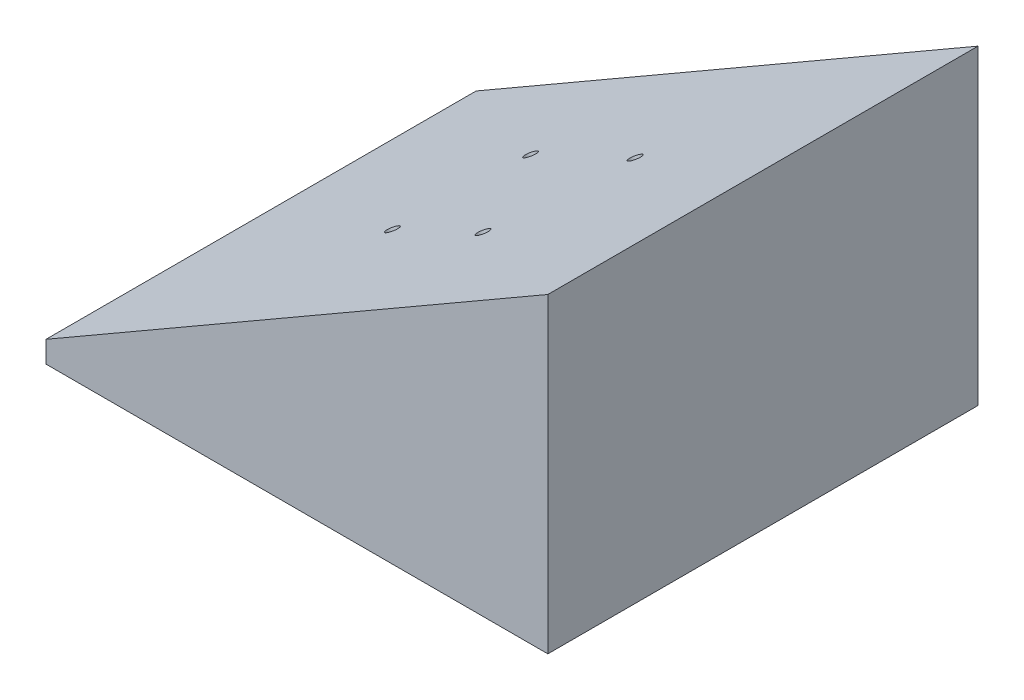
ISO-10303-21;
HEADER;
FILE_DESCRIPTION(('STEP AP214'),'2;1');
FILE_NAME('part.step','',(''),(''),'','','');
FILE_SCHEMA(('AUTOMOTIVE_DESIGN { 1 0 10303 214 1 1 1 1 }'));
ENDSEC;
DATA;
#1=APPLICATION_CONTEXT('core data for automotive mechanical design processes');
#2=APPLICATION_PROTOCOL_DEFINITION('international standard','automotive_design',2000,#1);
#3=PRODUCT_CONTEXT('',#1,'mechanical');
#4=PRODUCT('Part','Part','',(#3));
#5=PRODUCT_RELATED_PRODUCT_CATEGORY('part','',(#4));
#6=PRODUCT_DEFINITION_FORMATION('','',#4);
#7=PRODUCT_DEFINITION_CONTEXT('part definition',#1,'design');
#8=PRODUCT_DEFINITION('design','',#6,#7);
#9=PRODUCT_DEFINITION_SHAPE('','',#8);
#10=(LENGTH_UNIT() NAMED_UNIT(*) SI_UNIT(.MILLI.,.METRE.));
#11=(NAMED_UNIT(*) PLANE_ANGLE_UNIT() SI_UNIT($,.RADIAN.));
#12=(NAMED_UNIT(*) SI_UNIT($,.STERADIAN.) SOLID_ANGLE_UNIT());
#13=UNCERTAINTY_MEASURE_WITH_UNIT(LENGTH_MEASURE(1.E-05),#10,'distance_accuracy_value','');
#14=(GEOMETRIC_REPRESENTATION_CONTEXT(3) GLOBAL_UNCERTAINTY_ASSIGNED_CONTEXT((#13)) GLOBAL_UNIT_ASSIGNED_CONTEXT((#10,
#11,#12)) REPRESENTATION_CONTEXT('',''));
#15=CARTESIAN_POINT('',(0.,0.,0.));
#16=DIRECTION('',(0.,0.,1.));
#17=DIRECTION('',(1.,0.,0.));
#18=AXIS2_PLACEMENT_3D('',#15,#16,#17);
#19=CARTESIAN_POINT('',(0.,3.,60.));
#20=DIRECTION('',(1.,0.,0.));
#21=DIRECTION('',(0.,0.,-1.));
#22=AXIS2_PLACEMENT_3D('',#19,#20,#21);
#23=PLANE('',#22);
#24=DIRECTION('',(0.,-1.,0.));
#25=VECTOR('',#24,1.);
#26=CARTESIAN_POINT('',(0.,3.,0.));
#27=LINE('',#26,#25);
#28=CARTESIAN_POINT('',(0.,3.,0.));
#29=VERTEX_POINT('',#28);
#30=CARTESIAN_POINT('',(0.,0.,0.));
#31=VERTEX_POINT('',#30);
#32=EDGE_CURVE('E107',#29,#31,#27,.T.);
#33=ORIENTED_EDGE('',*,*,#32,.T.);
#34=DIRECTION('',(0.,0.,-1.));
#35=VECTOR('',#34,1.);
#36=CARTESIAN_POINT('',(0.,0.,60.));
#37=LINE('',#36,#35);
#38=CARTESIAN_POINT('',(0.,0.,60.));
#39=VERTEX_POINT('',#38);
#40=EDGE_CURVE('E11',#39,#31,#37,.T.);
#41=ORIENTED_EDGE('',*,*,#40,.F.);
#42=DIRECTION('',(0.,-1.,0.));
#43=VECTOR('',#42,1.);
#44=CARTESIAN_POINT('',(0.,3.,60.));
#45=LINE('',#44,#43);
#46=CARTESIAN_POINT('',(0.,3.,60.));
#47=VERTEX_POINT('',#46);
#48=EDGE_CURVE('E94',#47,#39,#45,.T.);
#49=ORIENTED_EDGE('',*,*,#48,.F.);
#50=DIRECTION('',(0.,0.,-1.));
#51=VECTOR('',#50,1.);
#52=CARTESIAN_POINT('',(0.,3.,60.));
#53=LINE('',#52,#51);
#54=EDGE_CURVE('E103',#47,#29,#53,.T.);
#55=ORIENTED_EDGE('',*,*,#54,.T.);
#56=EDGE_LOOP('',(#33,#41,#49,#55));
#57=FACE_BOUND('',#56,.T.);
#58=ADVANCED_FACE('F41',(#57),#23,.F.);
#59=CARTESIAN_POINT('',(0.,0.,60.));
#60=DIRECTION('',(0.,1.,0.));
#61=DIRECTION('',(0.,0.,1.));
#62=AXIS2_PLACEMENT_3D('',#59,#60,#61);
#63=PLANE('',#62);
#64=CARTESIAN_POINT('',(37.8666938636784,0.,19.503));
#65=DIRECTION('',(0.,1.,0.));
#66=DIRECTION('',(-1.,0.,0.));
#67=AXIS2_PLACEMENT_3D('',#64,#65,#66);
#68=ELLIPSE('',#67,0.981495457622363,0.849999999999999);
#69=CARTESIAN_POINT('',(36.8851984060561,0.,19.503));
#70=VERTEX_POINT('',#69);
#71=EDGE_CURVE('E110',#70,#70,#68,.T.);
#72=ORIENTED_EDGE('',*,*,#71,.T.);
#73=EDGE_LOOP('',(#72));
#74=FACE_BOUND('',#73,.T.);
#75=CARTESIAN_POINT('',(35.996078991504,0.,37.391));
#76=DIRECTION('',(0.,1.,0.));
#77=DIRECTION('',(-1.,0.,0.));
#78=AXIS2_PLACEMENT_3D('',#75,#76,#77);
#79=ELLIPSE('',#78,0.981495457622365,0.850000000000001);
#80=CARTESIAN_POINT('',(35.0145835338817,0.,37.391));
#81=VERTEX_POINT('',#80);
#82=EDGE_CURVE('E124',#81,#81,#79,.T.);
#83=ORIENTED_EDGE('',*,*,#82,.T.);
#84=EDGE_LOOP('',(#83));
#85=FACE_BOUND('',#84,.T.);
#86=DIRECTION('',(1.,0.,0.));
#87=VECTOR('',#86,1.);
#88=CARTESIAN_POINT('',(0.,0.,0.));
#89=LINE('',#88,#87);
#90=CARTESIAN_POINT('',(70.,0.,0.));
#91=VERTEX_POINT('',#90);
#92=EDGE_CURVE('E98',#31,#91,#89,.T.);
#93=ORIENTED_EDGE('',*,*,#92,.T.);
#94=DIRECTION('',(0.,0.,-1.));
#95=VECTOR('',#94,1.);
#96=CARTESIAN_POINT('',(70.,0.,60.));
#97=LINE('',#96,#95);
#98=CARTESIAN_POINT('',(70.,0.,60.));
#99=VERTEX_POINT('',#98);
#100=EDGE_CURVE('E50',#99,#91,#97,.T.);
#101=ORIENTED_EDGE('',*,*,#100,.F.);
#102=DIRECTION('',(1.,0.,0.));
#103=VECTOR('',#102,1.);
#104=CARTESIAN_POINT('',(0.,0.,60.));
#105=LINE('',#104,#103);
#106=EDGE_CURVE('E89',#39,#99,#105,.T.);
#107=ORIENTED_EDGE('',*,*,#106,.F.);
#108=ORIENTED_EDGE('',*,*,#40,.T.);
#109=EDGE_LOOP('',(#93,#101,#107,#108));
#110=FACE_BOUND('',#109,.T.);
#111=ADVANCED_FACE('F97',(#74,#85,#110),#63,.F.);
#112=CARTESIAN_POINT('',(70.,0.,60.));
#113=DIRECTION('',(-1.,0.,0.));
#114=DIRECTION('',(0.,0.,1.));
#115=AXIS2_PLACEMENT_3D('',#112,#113,#114);
#116=PLANE('',#115);
#117=DIRECTION('',(0.,1.,0.));
#118=VECTOR('',#117,1.);
#119=CARTESIAN_POINT('',(70.,0.,0.));
#120=LINE('',#119,#118);
#121=CARTESIAN_POINT('',(70.,43.4145188432738,0.));
#122=VERTEX_POINT('',#121);
#123=EDGE_CURVE('E76',#91,#122,#120,.T.);
#124=ORIENTED_EDGE('',*,*,#123,.T.);
#125=DIRECTION('',(0.,0.,-1.));
#126=VECTOR('',#125,1.);
#127=CARTESIAN_POINT('',(70.,43.4145188432738,60.));
#128=LINE('',#127,#126);
#129=CARTESIAN_POINT('',(70.,43.4145188432738,60.));
#130=VERTEX_POINT('',#129);
#131=EDGE_CURVE('E99',#130,#122,#128,.T.);
#132=ORIENTED_EDGE('',*,*,#131,.F.);
#133=DIRECTION('',(0.,1.,0.));
#134=VECTOR('',#133,1.);
#135=CARTESIAN_POINT('',(70.,0.,60.));
#136=LINE('',#135,#134);
#137=EDGE_CURVE('E92',#99,#130,#136,.T.);
#138=ORIENTED_EDGE('',*,*,#137,.F.);
#139=ORIENTED_EDGE('',*,*,#100,.T.);
#140=EDGE_LOOP('',(#124,#132,#138,#139));
#141=FACE_BOUND('',#140,.T.);
#142=ADVANCED_FACE('F101',(#141),#116,.F.);
#143=CARTESIAN_POINT('',(70.,43.4145188432738,60.));
#144=DIRECTION('',(0.5,-0.866025403784439,0.));
#145=DIRECTION('',(0.866025403784439,0.5,0.));
#146=AXIS2_PLACEMENT_3D('',#143,#144,#145);
#147=PLANE('',#146);
#148=CARTESIAN_POINT('',(27.1009822920822,18.6467594216369,19.503));
#149=DIRECTION('',(0.5,-0.866025403784439,0.));
#150=DIRECTION('',(0.866025403784439,0.5,0.));
#151=AXIS2_PLACEMENT_3D('',#148,#149,#150);
#152=CIRCLE('',#151,0.849999999999999);
#153=CARTESIAN_POINT('',(27.8371038852989,19.0717594216369,19.503));
#154=VERTEX_POINT('',#153);
#155=EDGE_CURVE('E44',#154,#154,#152,.T.);
#156=ORIENTED_EDGE('',*,*,#155,.T.);
#157=EDGE_LOOP('',(#156));
#158=FACE_BOUND('',#157,.T.);
#159=CARTESIAN_POINT('',(25.6980211379514,17.8367594216369,37.391));
#160=DIRECTION('',(0.5,-0.866025403784439,0.));
#161=DIRECTION('',(0.866025403784439,0.5,0.));
#162=AXIS2_PLACEMENT_3D('',#159,#160,#161);
#163=CIRCLE('',#162,0.850000000000001);
#164=CARTESIAN_POINT('',(26.4341427311681,18.2617594216369,37.391));
#165=VERTEX_POINT('',#164);
#166=EDGE_CURVE('E122',#165,#165,#163,.T.);
#167=ORIENTED_EDGE('',*,*,#166,.T.);
#168=EDGE_LOOP('',(#167));
#169=FACE_BOUND('',#168,.T.);
#170=CARTESIAN_POINT('',(41.4605495122319,26.9372594216369,40.502));
#171=DIRECTION('',(0.5,-0.866025403784439,0.));
#172=DIRECTION('',(0.866025403784439,0.5,0.));
#173=AXIS2_PLACEMENT_3D('',#170,#171,#172);
#174=CIRCLE('',#173,0.849999999999998);
#175=CARTESIAN_POINT('',(42.1966711054487,27.3622594216369,40.502));
#176=VERTEX_POINT('',#175);
#177=EDGE_CURVE('E119',#176,#176,#174,.T.);
#178=ORIENTED_EDGE('',*,*,#177,.T.);
#179=EDGE_LOOP('',(#178));
#180=FACE_BOUND('',#179,.T.);
#181=CARTESIAN_POINT('',(45.2944439747856,29.1507594216369,23.123));
#182=DIRECTION('',(0.5,-0.866025403784439,0.));
#183=DIRECTION('',(0.866025403784439,0.5,0.));
#184=AXIS2_PLACEMENT_3D('',#181,#182,#183);
#185=CIRCLE('',#184,0.849999999999999);
#186=CARTESIAN_POINT('',(46.0305655680024,29.5757594216369,23.123));
#187=VERTEX_POINT('',#186);
#188=EDGE_CURVE('E116',#187,#187,#185,.T.);
#189=ORIENTED_EDGE('',*,*,#188,.T.);
#190=EDGE_LOOP('',(#189));
#191=FACE_BOUND('',#190,.T.);
#192=DIRECTION('',(-0.866025403784439,-0.5,0.));
#193=VECTOR('',#192,1.);
#194=CARTESIAN_POINT('',(70.,43.4145188432738,0.));
#195=LINE('',#194,#193);
#196=EDGE_CURVE('E82',#122,#29,#195,.T.);
#197=ORIENTED_EDGE('',*,*,#196,.T.);
#198=ORIENTED_EDGE('',*,*,#54,.F.);
#199=DIRECTION('',(-0.866025403784439,-0.5,0.));
#200=VECTOR('',#199,1.);
#201=CARTESIAN_POINT('',(70.,43.4145188432738,60.));
#202=LINE('',#201,#200);
#203=EDGE_CURVE('E59',#130,#47,#202,.T.);
#204=ORIENTED_EDGE('',*,*,#203,.F.);
#205=ORIENTED_EDGE('',*,*,#131,.T.);
#206=EDGE_LOOP('',(#197,#198,#204,#205));
#207=FACE_BOUND('',#206,.T.);
#208=ADVANCED_FACE('F170',(#158,#169,#180,#191,#207),#147,.F.);
#209=CARTESIAN_POINT('',(0.,0.,60.));
#210=DIRECTION('',(0.,0.,1.));
#211=DIRECTION('',(1.,0.,0.));
#212=AXIS2_PLACEMENT_3D('',#209,#210,#211);
#213=PLANE('',#212);
#214=ORIENTED_EDGE('',*,*,#48,.T.);
#215=ORIENTED_EDGE('',*,*,#106,.T.);
#216=ORIENTED_EDGE('',*,*,#137,.T.);
#217=ORIENTED_EDGE('',*,*,#203,.T.);
#218=EDGE_LOOP('',(#214,#215,#216,#217));
#219=FACE_BOUND('',#218,.T.);
#220=ADVANCED_FACE('F90',(#219),#213,.T.);
#221=CARTESIAN_POINT('',(0.,0.,0.));
#222=DIRECTION('',(0.,0.,1.));
#223=DIRECTION('',(1.,0.,0.));
#224=AXIS2_PLACEMENT_3D('',#221,#222,#223);
#225=PLANE('',#224);
#226=ORIENTED_EDGE('',*,*,#32,.F.);
#227=ORIENTED_EDGE('',*,*,#196,.F.);
#228=ORIENTED_EDGE('',*,*,#123,.F.);
#229=ORIENTED_EDGE('',*,*,#92,.F.);
#230=EDGE_LOOP('',(#226,#227,#228,#229));
#231=FACE_BOUND('',#230,.T.);
#232=ADVANCED_FACE('F159',(#231),#225,.F.);
#233=CARTESIAN_POINT('',(60.2944439747856,3.16999730810376,23.123));
#234=DIRECTION('',(-0.5,0.866025403784439,0.));
#235=DIRECTION('',(-0.866025403784439,-0.5,0.));
#236=AXIS2_PLACEMENT_3D('',#233,#234,#235);
#237=CYLINDRICAL_SURFACE('',#236,0.849999999999999);
#238=CARTESIAN_POINT('',(60.2944439747856,3.16999730810376,23.123));
#239=DIRECTION('',(-0.5,0.866025403784439,0.));
#240=DIRECTION('',(-0.866025403784439,-0.5,0.));
#241=AXIS2_PLACEMENT_3D('',#238,#239,#240);
#242=CIRCLE('',#241,0.849999999999999);
#243=CARTESIAN_POINT('',(59.5583223815689,2.74499730810376,23.123));
#244=VERTEX_POINT('',#243);
#245=EDGE_CURVE('E120',#244,#244,#242,.T.);
#246=ORIENTED_EDGE('',*,*,#245,.F.);
#247=EDGE_LOOP('',(#246));
#248=FACE_BOUND('',#247,.T.);
#249=ORIENTED_EDGE('',*,*,#188,.F.);
#250=EDGE_LOOP('',(#249));
#251=FACE_BOUND('',#250,.T.);
#252=ADVANCED_FACE('F161',(#248,#251),#237,.F.);
#253=CARTESIAN_POINT('',(60.2944439747856,3.16999730810376,23.123));
#254=DIRECTION('',(-0.5,0.866025403784439,0.));
#255=DIRECTION('',(-0.866025403784439,-0.5,0.));
#256=AXIS2_PLACEMENT_3D('',#253,#254,#255);
#257=PLANE('',#256);
#258=ORIENTED_EDGE('',*,*,#245,.T.);
#259=EDGE_LOOP('',(#258));
#260=FACE_BOUND('',#259,.T.);
#261=ADVANCED_FACE('F167',(#260),#257,.T.);
#262=CARTESIAN_POINT('',(56.4605495122319,0.956497308103758,40.502));
#263=DIRECTION('',(-0.5,0.866025403784439,0.));
#264=DIRECTION('',(-0.866025403784439,-0.5,0.));
#265=AXIS2_PLACEMENT_3D('',#262,#263,#264);
#266=CYLINDRICAL_SURFACE('',#265,0.849999999999998);
#267=CARTESIAN_POINT('',(56.4605495122319,0.956497308103758,40.502));
#268=DIRECTION('',(-0.5,0.866025403784439,0.));
#269=DIRECTION('',(-0.866025403784439,-0.5,0.));
#270=AXIS2_PLACEMENT_3D('',#267,#268,#269);
#271=CIRCLE('',#270,0.849999999999998);
#272=CARTESIAN_POINT('',(55.7244279190152,0.531497308103759,40.502));
#273=VERTEX_POINT('',#272);
#274=EDGE_CURVE('E134',#273,#273,#271,.T.);
#275=ORIENTED_EDGE('',*,*,#274,.F.);
#276=EDGE_LOOP('',(#275));
#277=FACE_BOUND('',#276,.T.);
#278=ORIENTED_EDGE('',*,*,#177,.F.);
#279=EDGE_LOOP('',(#278));
#280=FACE_BOUND('',#279,.T.);
#281=ADVANCED_FACE('F231',(#277,#280),#266,.F.);
#282=CARTESIAN_POINT('',(56.4605495122319,0.956497308103758,40.502));
#283=DIRECTION('',(-0.5,0.866025403784439,0.));
#284=DIRECTION('',(-0.866025403784439,-0.5,0.));
#285=AXIS2_PLACEMENT_3D('',#282,#283,#284);
#286=PLANE('',#285);
#287=ORIENTED_EDGE('',*,*,#274,.T.);
#288=EDGE_LOOP('',(#287));
#289=FACE_BOUND('',#288,.T.);
#290=ADVANCED_FACE('F148',(#289),#286,.T.);
#291=CARTESIAN_POINT('',(40.6980211379514,-8.14400269189625,37.391));
#292=DIRECTION('',(-0.5,0.866025403784439,0.));
#293=DIRECTION('',(-0.866025403784439,-0.5,0.));
#294=AXIS2_PLACEMENT_3D('',#291,#292,#293);
#295=CYLINDRICAL_SURFACE('',#294,0.850000000000001);
#296=ORIENTED_EDGE('',*,*,#166,.F.);
#297=EDGE_LOOP('',(#296));
#298=FACE_BOUND('',#297,.T.);
#299=ORIENTED_EDGE('',*,*,#82,.F.);
#300=EDGE_LOOP('',(#299));
#301=FACE_BOUND('',#300,.T.);
#302=ADVANCED_FACE('F142',(#298,#301),#295,.F.);
#303=CARTESIAN_POINT('',(42.1009822920822,-7.33400269189625,19.503));
#304=DIRECTION('',(-0.5,0.866025403784439,0.));
#305=DIRECTION('',(-0.866025403784439,-0.5,0.));
#306=AXIS2_PLACEMENT_3D('',#303,#304,#305);
#307=CYLINDRICAL_SURFACE('',#306,0.849999999999999);
#308=ORIENTED_EDGE('',*,*,#155,.F.);
#309=EDGE_LOOP('',(#308));
#310=FACE_BOUND('',#309,.T.);
#311=ORIENTED_EDGE('',*,*,#71,.F.);
#312=EDGE_LOOP('',(#311));
#313=FACE_BOUND('',#312,.T.);
#314=ADVANCED_FACE('F140',(#310,#313),#307,.F.);
#315=CLOSED_SHELL('',(#58,#111,#142,#208,#220,#232,#252,#261,#281,#290,#302,#314));
#316=MANIFOLD_SOLID_BREP('B2',#315);
#317=ADVANCED_BREP_SHAPE_REPRESENTATION('',(#18,#316),#14);
#318=SHAPE_DEFINITION_REPRESENTATION(#9,#317);
ENDSEC;
END-ISO-10303-21;
